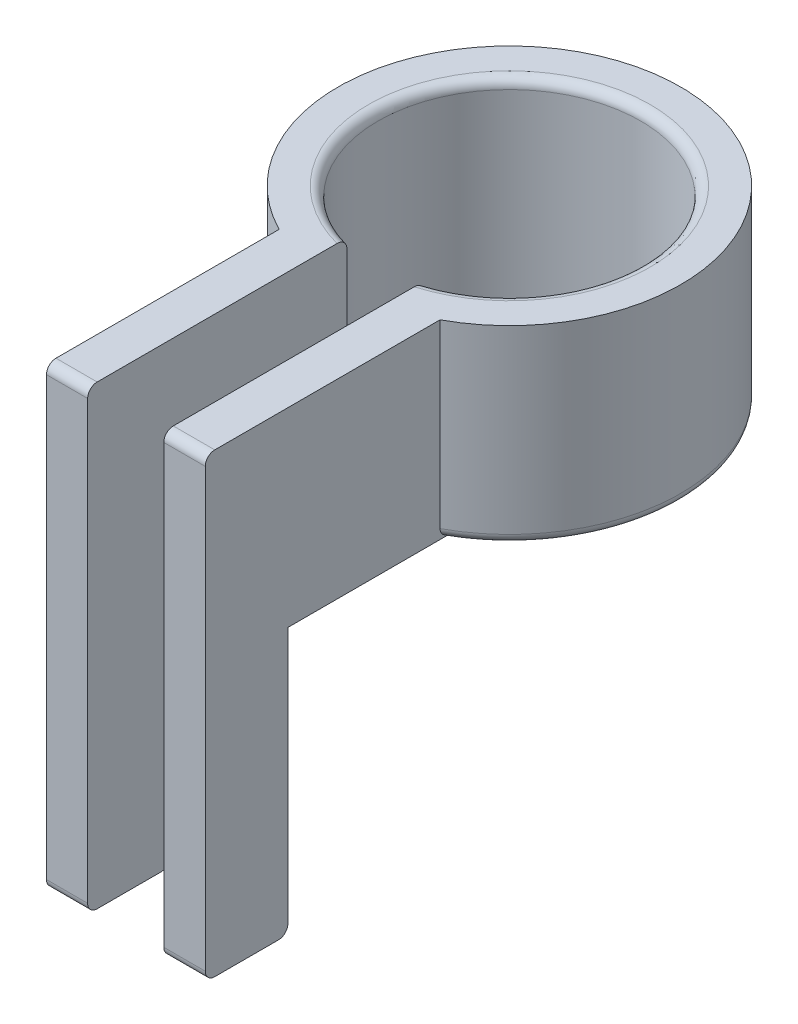
ISO-10303-21;
HEADER;
FILE_DESCRIPTION(('STEP AP214'),'2;1');
FILE_NAME('part.step','',(''),(''),'','','');
FILE_SCHEMA(('AUTOMOTIVE_DESIGN { 1 0 10303 214 1 1 1 1 }'));
ENDSEC;
DATA;
#1=APPLICATION_CONTEXT('core data for automotive mechanical design processes');
#2=APPLICATION_PROTOCOL_DEFINITION('international standard','automotive_design',2000,#1);
#3=PRODUCT_CONTEXT('',#1,'mechanical');
#4=PRODUCT('Part','Part','',(#3));
#5=PRODUCT_RELATED_PRODUCT_CATEGORY('part','',(#4));
#6=PRODUCT_DEFINITION_FORMATION('','',#4);
#7=PRODUCT_DEFINITION_CONTEXT('part definition',#1,'design');
#8=PRODUCT_DEFINITION('design','',#6,#7);
#9=PRODUCT_DEFINITION_SHAPE('','',#8);
#10=(LENGTH_UNIT() NAMED_UNIT(*) SI_UNIT(.MILLI.,.METRE.));
#11=(NAMED_UNIT(*) PLANE_ANGLE_UNIT() SI_UNIT($,.RADIAN.));
#12=(NAMED_UNIT(*) SI_UNIT($,.STERADIAN.) SOLID_ANGLE_UNIT());
#13=UNCERTAINTY_MEASURE_WITH_UNIT(LENGTH_MEASURE(1.E-05),#10,'distance_accuracy_value','');
#14=(GEOMETRIC_REPRESENTATION_CONTEXT(3) GLOBAL_UNCERTAINTY_ASSIGNED_CONTEXT((#13)) GLOBAL_UNIT_ASSIGNED_CONTEXT((#10,
#11,#12)) REPRESENTATION_CONTEXT('',''));
#15=CARTESIAN_POINT('',(0.,0.,0.));
#16=DIRECTION('',(0.,0.,1.));
#17=DIRECTION('',(1.,0.,0.));
#18=AXIS2_PLACEMENT_3D('',#15,#16,#17);
#19=CARTESIAN_POINT('',(2.09705188399781,-4.,12.9634038678451));
#20=DIRECTION('',(1.,0.,0.));
#21=DIRECTION('',(0.,0.,-1.));
#22=AXIS2_PLACEMENT_3D('',#19,#20,#21);
#23=PLANE('',#22);
#24=DIRECTION('',(0.,0.,-1.));
#25=VECTOR('',#24,1.);
#26=CARTESIAN_POINT('',(2.09705188399781,10.,12.9634038678451));
#27=LINE('',#26,#25);
#28=CARTESIAN_POINT('',(2.09705188399781,10.,19.7544731693429));
#29=VERTEX_POINT('',#28);
#30=CARTESIAN_POINT('',(2.09705188399781,10.,7.09664522121694));
#31=VERTEX_POINT('',#30);
#32=EDGE_CURVE('E236',#29,#31,#27,.T.);
#33=ORIENTED_EDGE('',*,*,#32,.T.);
#34=CARTESIAN_POINT('',(2.09705188399781,10.,7.09664522121694));
#35=CARTESIAN_POINT('',(2.09705188399781,10.0000188775019,7.06625435999718));
#36=CARTESIAN_POINT('',(2.09705188399781,9.99745261189992,7.03586584315379));
#37=CARTESIAN_POINT('',(2.09705188399781,9.98729891168458,6.97592711742204));
#38=CARTESIAN_POINT('',(2.09705188399781,9.9797095170185,6.94637724047153));
#39=CARTESIAN_POINT('',(2.09705188399781,9.95965111756215,6.88895219575835));
#40=CARTESIAN_POINT('',(2.09705188399781,9.94717833114842,6.86107834522858));
#41=CARTESIAN_POINT('',(2.09705188399781,9.91765249809959,6.8078823019234));
#42=CARTESIAN_POINT('',(2.09705188399781,9.90060158759663,6.78255892666619));
#43=CARTESIAN_POINT('',(2.09705188399781,9.86268485121475,6.73570644097138));
#44=CARTESIAN_POINT('',(2.09705188399781,9.84189415748589,6.71411662887507));
#45=CARTESIAN_POINT('',(2.09705188399781,9.7968322326706,6.67491908536733));
#46=CARTESIAN_POINT('',(2.09705188399781,9.77256082293616,6.65731155846659));
#47=CARTESIAN_POINT('',(2.09705188399781,9.7223443445838,6.62740549016463));
#48=CARTESIAN_POINT('',(2.09705188399781,9.69651504196629,6.61491231103185));
#49=CARTESIAN_POINT('',(2.09705188399781,9.64307396381817,6.59467453520273));
#50=CARTESIAN_POINT('',(2.09705188399781,9.61546455612112,6.58692376869906));
#51=CARTESIAN_POINT('',(2.09705188399781,9.57299556592643,6.57900624714735));
#52=CARTESIAN_POINT('',(2.09705188399781,9.55845981802753,6.57698436611936));
#53=CARTESIAN_POINT('',(2.09705188399781,9.52928527044598,6.57428791897843));
#54=CARTESIAN_POINT('',(2.09705188399781,9.51464665151205,6.57361139647195));
#55=CARTESIAN_POINT('',(2.09705188399781,9.50000000000002,6.57361189878289));
#56=B_SPLINE_CURVE_WITH_KNOTS('',3,(#34,#35,#36,#37,#38,#39,#40,#41,#42,#43,#44,#45,#46,#47,#48,
#49,#50,#51,#52,#53,#54,#55),.UNSPECIFIED.,.F.,.F.,(4,2,2,2,2,2,2,2,2,2,4),(0.,
0.091062540378094,0.182160634828733,0.273329414217606,0.364455728366105,0.453922459995972,
0.543393785156623,0.629043563638756,0.71458167479767,0.758554227874326,0.802462790045606),.UNSPECIFIED.);
#57=CARTESIAN_POINT('',(2.09705188399781,9.5,6.57361189878299));
#58=VERTEX_POINT('',#57);
#59=EDGE_CURVE('E11',#31,#58,#56,.T.);
#60=ORIENTED_EDGE('',*,*,#59,.T.);
#61=DIRECTION('',(0.,-1.,0.));
#62=VECTOR('',#61,1.);
#63=CARTESIAN_POINT('',(2.09705188399781,10.,6.57361189878299));
#64=LINE('',#63,#62);
#65=CARTESIAN_POINT('',(2.09705188399781,0.,6.57361189878299));
#66=VERTEX_POINT('',#65);
#67=EDGE_CURVE('E248',#58,#66,#64,.T.);
#68=ORIENTED_EDGE('',*,*,#67,.T.);
#69=DIRECTION('',(0.,0.,-1.));
#70=VECTOR('',#69,1.);
#71=CARTESIAN_POINT('',(2.09705188399781,0.,0.));
#72=LINE('',#71,#70);
#73=CARTESIAN_POINT('',(2.09705188399781,0.,15.9099745186424));
#74=VERTEX_POINT('',#73);
#75=EDGE_CURVE('E238',#74,#66,#72,.T.);
#76=ORIENTED_EDGE('',*,*,#75,.F.);
#77=DIRECTION('',(0.,1.,0.));
#78=VECTOR('',#77,1.);
#79=CARTESIAN_POINT('',(2.09705188399781,-4.,15.9099745186424));
#80=LINE('',#79,#78);
#81=CARTESIAN_POINT('',(2.09705188399781,-13.4702890247354,15.9099745186424));
#82=VERTEX_POINT('',#81);
#83=EDGE_CURVE('E203',#82,#74,#80,.T.);
#84=ORIENTED_EDGE('',*,*,#83,.F.);
#85=CARTESIAN_POINT('',(2.09705188399781,-13.4702890247354,16.4099745186424));
#86=DIRECTION('',(1.,0.,0.));
#87=DIRECTION('',(0.,0.,-1.));
#88=AXIS2_PLACEMENT_3D('',#85,#86,#87);
#89=CIRCLE('',#88,0.5);
#90=CARTESIAN_POINT('',(2.09705188399781,-13.9702890247354,16.4099745186424));
#91=VERTEX_POINT('',#90);
#92=EDGE_CURVE('E263',#82,#91,#89,.F.);
#93=ORIENTED_EDGE('',*,*,#92,.T.);
#94=DIRECTION('',(0.,0.,1.));
#95=VECTOR('',#94,1.);
#96=CARTESIAN_POINT('',(2.09705188399781,-13.9702890247354,20.7544731693429));
#97=LINE('',#96,#95);
#98=CARTESIAN_POINT('',(2.09705188399781,-13.9702890247354,19.7544731693429));
#99=VERTEX_POINT('',#98);
#100=EDGE_CURVE('E226',#91,#99,#97,.T.);
#101=ORIENTED_EDGE('',*,*,#100,.T.);
#102=CARTESIAN_POINT('',(2.09705188399781,-13.4702890247354,19.7544731693429));
#103=DIRECTION('',(1.,0.,0.));
#104=DIRECTION('',(0.,0.,-1.));
#105=AXIS2_PLACEMENT_3D('',#102,#103,#104);
#106=CIRCLE('',#105,0.5);
#107=CARTESIAN_POINT('',(2.09705188399781,-13.4702890247354,20.2544731693429));
#108=VERTEX_POINT('',#107);
#109=EDGE_CURVE('E261',#99,#108,#106,.F.);
#110=ORIENTED_EDGE('',*,*,#109,.T.);
#111=DIRECTION('',(0.,-1.,0.));
#112=VECTOR('',#111,1.);
#113=CARTESIAN_POINT('',(2.09705188399781,-4.,20.2544731693429));
#114=LINE('',#113,#112);
#115=CARTESIAN_POINT('',(2.09705188399781,9.5,20.2544731693429));
#116=VERTEX_POINT('',#115);
#117=EDGE_CURVE('E386',#116,#108,#114,.T.);
#118=ORIENTED_EDGE('',*,*,#117,.F.);
#119=CARTESIAN_POINT('',(2.09705188399781,9.5,19.7544731693429));
#120=DIRECTION('',(1.,0.,0.));
#121=DIRECTION('',(0.,0.,-1.));
#122=AXIS2_PLACEMENT_3D('',#119,#120,#121);
#123=CIRCLE('',#122,0.5);
#124=EDGE_CURVE('E259',#116,#29,#123,.F.);
#125=ORIENTED_EDGE('',*,*,#124,.T.);
#126=EDGE_LOOP('',(#33,#60,#68,#76,#84,#93,#101,#110,#118,#125));
#127=FACE_BOUND('',#126,.T.);
#128=ADVANCED_FACE('F35',(#127),#23,.F.);
#129=CARTESIAN_POINT('',(-1.90294811600219,-4.,12.9634038678451));
#130=DIRECTION('',(-1.,0.,0.));
#131=DIRECTION('',(0.,0.,1.));
#132=AXIS2_PLACEMENT_3D('',#129,#130,#131);
#133=PLANE('',#132);
#134=DIRECTION('',(0.,-1.,0.));
#135=VECTOR('',#134,1.);
#136=CARTESIAN_POINT('',(-1.90294811600219,10.,6.63240442583259));
#137=LINE('',#136,#135);
#138=CARTESIAN_POINT('',(-1.90294811600219,0.,6.63240442583259));
#139=VERTEX_POINT('',#138);
#140=CARTESIAN_POINT('',(-1.90294811600219,9.5,6.63240442583259));
#141=VERTEX_POINT('',#140);
#142=EDGE_CURVE('E250',#139,#141,#137,.F.);
#143=ORIENTED_EDGE('',*,*,#142,.T.);
#144=CARTESIAN_POINT('',(-1.90294811600219,9.5,6.63240442583259));
#145=CARTESIAN_POINT('',(-1.90294811600219,9.52735933135736,6.63237578562355));
#146=CARTESIAN_POINT('',(-1.90294811600219,9.55470467174101,6.63473874932025));
#147=CARTESIAN_POINT('',(-1.90294811600219,9.60855728686477,6.64402811425362));
#148=CARTESIAN_POINT('',(-1.90294811600219,9.63506606325586,6.65094578631533));
#149=CARTESIAN_POINT('',(-1.90294811600219,9.68654775867712,6.66912699957518));
#150=CARTESIAN_POINT('',(-1.90294811600219,9.71152056182817,6.68039086820026));
#151=CARTESIAN_POINT('',(-1.90294811600219,9.75926731161516,6.70687987951667));
#152=CARTESIAN_POINT('',(-1.90294811600219,9.78204093102345,6.72210561047205));
#153=CARTESIAN_POINT('',(-1.90294811600219,9.82518842881762,6.75633774751278));
#154=CARTESIAN_POINT('',(-1.90294811600219,9.84551397595586,6.77540500217635));
#155=CARTESIAN_POINT('',(-1.90294811600219,9.88281527166546,6.81657649871765));
#156=CARTESIAN_POINT('',(-1.90294811600219,9.89979015395107,6.83868152348578));
#157=CARTESIAN_POINT('',(-1.90294811600219,9.93055833073667,6.88615778894905));
#158=CARTESIAN_POINT('',(-1.90294811600219,9.9442131837314,6.91161868436731));
#159=CARTESIAN_POINT('',(-1.90294811600219,9.96720221611087,6.96441985737906));
#160=CARTESIAN_POINT('',(-1.90294811600219,9.97653695133058,6.99175989267852));
#161=CARTESIAN_POINT('',(-1.90294811600219,9.98905155348706,7.04114070690321));
#162=CARTESIAN_POINT('',(-1.90294811600219,9.99315348686667,7.06295303154366));
#163=CARTESIAN_POINT('',(-1.90294811600219,9.9986279350332,7.10688774938061));
#164=CARTESIAN_POINT('',(-1.90294811600219,10.0000041054958,7.12900968715703));
#165=CARTESIAN_POINT('',(-1.90294811600219,10.,7.15113896297672));
#166=B_SPLINE_CURVE_WITH_KNOTS('',3,(#144,#145,#146,#147,#148,#149,#150,#151,#152,#153,#154,
#155,#156,#157,#158,#159,#160,#161,#162,#163,#164,#165),.UNSPECIFIED.,.F.,.F.,(4,2,2,2,2,2,2,2,
2,2,4),(0.,0.0819548066880283,0.163753001030306,0.245557358960154,0.32737387027808,
0.410605802400977,0.493859225323879,0.580145723703416,0.666421117201123,0.732841375343013,
0.799172493018446),.UNSPECIFIED.);
#167=CARTESIAN_POINT('',(-1.90294811600219,10.,7.15113896297672));
#168=VERTEX_POINT('',#167);
#169=EDGE_CURVE('E63',#141,#168,#166,.T.);
#170=ORIENTED_EDGE('',*,*,#169,.T.);
#171=DIRECTION('',(0.,0.,1.));
#172=VECTOR('',#171,1.);
#173=CARTESIAN_POINT('',(-1.90294811600219,10.,12.9634038678451));
#174=LINE('',#173,#172);
#175=CARTESIAN_POINT('',(-1.90294811600219,10.,19.7544731693429));
#176=VERTEX_POINT('',#175);
#177=EDGE_CURVE('E198',#168,#176,#174,.T.);
#178=ORIENTED_EDGE('',*,*,#177,.T.);
#179=CARTESIAN_POINT('',(-1.90294811600219,9.5,19.7544731693429));
#180=DIRECTION('',(-1.,0.,0.));
#181=DIRECTION('',(0.,0.,1.));
#182=AXIS2_PLACEMENT_3D('',#179,#180,#181);
#183=CIRCLE('',#182,0.5);
#184=CARTESIAN_POINT('',(-1.90294811600219,9.5,20.2544731693429));
#185=VERTEX_POINT('',#184);
#186=EDGE_CURVE('E280',#176,#185,#183,.F.);
#187=ORIENTED_EDGE('',*,*,#186,.T.);
#188=DIRECTION('',(0.,1.,0.));
#189=VECTOR('',#188,1.);
#190=CARTESIAN_POINT('',(-1.90294811600219,-4.,20.2544731693429));
#191=LINE('',#190,#189);
#192=CARTESIAN_POINT('',(-1.90294811600219,-13.4702890247354,20.2544731693429));
#193=VERTEX_POINT('',#192);
#194=EDGE_CURVE('E208',#193,#185,#191,.T.);
#195=ORIENTED_EDGE('',*,*,#194,.F.);
#196=CARTESIAN_POINT('',(-1.90294811600219,-13.4702890247354,19.7544731693429));
#197=DIRECTION('',(-1.,0.,0.));
#198=DIRECTION('',(0.,0.,1.));
#199=AXIS2_PLACEMENT_3D('',#196,#197,#198);
#200=CIRCLE('',#199,0.5);
#201=CARTESIAN_POINT('',(-1.90294811600219,-13.9702890247354,19.7544731693429));
#202=VERTEX_POINT('',#201);
#203=EDGE_CURVE('E282',#193,#202,#200,.F.);
#204=ORIENTED_EDGE('',*,*,#203,.T.);
#205=DIRECTION('',(0.,0.,-1.));
#206=VECTOR('',#205,1.);
#207=CARTESIAN_POINT('',(-1.90294811600219,-13.9702890247354,20.7544731693429));
#208=LINE('',#207,#206);
#209=CARTESIAN_POINT('',(-1.90294811600219,-13.9702890247354,16.4099745186424));
#210=VERTEX_POINT('',#209);
#211=EDGE_CURVE('E221',#202,#210,#208,.T.);
#212=ORIENTED_EDGE('',*,*,#211,.T.);
#213=CARTESIAN_POINT('',(-1.90294811600219,-13.4702890247354,16.4099745186424));
#214=DIRECTION('',(-1.,0.,0.));
#215=DIRECTION('',(0.,0.,1.));
#216=AXIS2_PLACEMENT_3D('',#213,#214,#215);
#217=CIRCLE('',#216,0.5);
#218=CARTESIAN_POINT('',(-1.90294811600219,-13.4702890247354,15.9099745186424));
#219=VERTEX_POINT('',#218);
#220=EDGE_CURVE('E284',#210,#219,#217,.F.);
#221=ORIENTED_EDGE('',*,*,#220,.T.);
#222=DIRECTION('',(0.,-1.,0.));
#223=VECTOR('',#222,1.);
#224=CARTESIAN_POINT('',(-1.90294811600219,-4.,15.9099745186424));
#225=LINE('',#224,#223);
#226=CARTESIAN_POINT('',(-1.90294811600219,0.,15.9099745186424));
#227=VERTEX_POINT('',#226);
#228=EDGE_CURVE('E214',#227,#219,#225,.T.);
#229=ORIENTED_EDGE('',*,*,#228,.F.);
#230=DIRECTION('',(0.,0.,1.));
#231=VECTOR('',#230,1.);
#232=CARTESIAN_POINT('',(-1.90294811600219,0.,0.));
#233=LINE('',#232,#231);
#234=EDGE_CURVE('E240',#139,#227,#233,.T.);
#235=ORIENTED_EDGE('',*,*,#234,.F.);
#236=EDGE_LOOP('',(#143,#170,#178,#187,#195,#204,#212,#221,#229,#235));
#237=FACE_BOUND('',#236,.T.);
#238=ADVANCED_FACE('F340',(#237),#133,.F.);
#239=CARTESIAN_POINT('',(4.27571816839784,0.,20.7544731693429));
#240=DIRECTION('',(1.,0.,0.));
#241=DIRECTION('',(0.,0.,-1.));
#242=AXIS2_PLACEMENT_3D('',#239,#240,#241);
#243=PLANE('',#242);
#244=DIRECTION('',(0.,0.,-1.));
#245=VECTOR('',#244,1.);
#246=CARTESIAN_POINT('',(4.27571816839784,-13.9702890247354,20.7544731693429));
#247=LINE('',#246,#245);
#248=CARTESIAN_POINT('',(4.27571816839784,-13.9702890247354,19.7544731693429));
#249=VERTEX_POINT('',#248);
#250=CARTESIAN_POINT('',(4.27571816839784,-13.9702890247354,16.4099745186424));
#251=VERTEX_POINT('',#250);
#252=EDGE_CURVE('E224',#249,#251,#247,.T.);
#253=ORIENTED_EDGE('',*,*,#252,.T.);
#254=CARTESIAN_POINT('',(4.27571816839784,-13.4702890247354,16.4099745186424));
#255=DIRECTION('',(1.,0.,0.));
#256=DIRECTION('',(0.,0.,-1.));
#257=AXIS2_PLACEMENT_3D('',#254,#255,#256);
#258=CIRCLE('',#257,0.5);
#259=CARTESIAN_POINT('',(4.27571816839784,-13.4702890247354,15.9099745186424));
#260=VERTEX_POINT('',#259);
#261=EDGE_CURVE('E183',#251,#260,#258,.T.);
#262=ORIENTED_EDGE('',*,*,#261,.T.);
#263=DIRECTION('',(0.,1.,0.));
#264=VECTOR('',#263,1.);
#265=CARTESIAN_POINT('',(4.27571816839784,-18.,15.9099745186424));
#266=LINE('',#265,#264);
#267=CARTESIAN_POINT('',(4.27571816839784,0.,15.9099745186424));
#268=VERTEX_POINT('',#267);
#269=EDGE_CURVE('E176',#260,#268,#266,.T.);
#270=ORIENTED_EDGE('',*,*,#269,.T.);
#271=DIRECTION('',(0.,0.,-1.));
#272=VECTOR('',#271,1.);
#273=CARTESIAN_POINT('',(4.27571816839784,0.,20.7544731693429));
#274=LINE('',#273,#272);
#275=CARTESIAN_POINT('',(4.27571816839784,0.,7.34630751768755));
#276=VERTEX_POINT('',#275);
#277=EDGE_CURVE('E180',#268,#276,#274,.T.);
#278=ORIENTED_EDGE('',*,*,#277,.T.);
#279=CARTESIAN_POINT('',(4.27571816839784,0.,7.34630751768755));
#280=CARTESIAN_POINT('',(4.27571816839784,-2.35764446130284E-05,7.38886967326927));
#281=CARTESIAN_POINT('',(4.27571816839784,0.00406136944300871,7.43152501971392));
#282=CARTESIAN_POINT('',(4.27571816839784,0.0205145574412388,7.51547808303228));
#283=CARTESIAN_POINT('',(4.27571816839784,0.0329354130536198,7.55676541759811));
#284=CARTESIAN_POINT('',(4.27571816839784,0.0636792777047655,7.63001606460742));
#285=CARTESIAN_POINT('',(4.27571816839784,0.0808612233390834,7.66245633374361));
#286=CARTESIAN_POINT('',(4.27571816839784,0.121086003502712,7.72338216355099));
#287=CARTESIAN_POINT('',(4.27571816839784,0.144109781690139,7.75188012587511));
#288=CARTESIAN_POINT('',(4.27571816839784,0.192508418115697,7.80044477241843));
#289=CARTESIAN_POINT('',(4.27571816839784,0.217280285336004,7.82111061945789));
#290=CARTESIAN_POINT('',(4.27571816839784,0.270383913995009,7.85719112874437));
#291=CARTESIAN_POINT('',(4.27571816839784,0.298711426504048,7.8726119784005));
#292=CARTESIAN_POINT('',(4.27571816839784,0.355391681618556,7.89617705713714));
#293=CARTESIAN_POINT('',(4.27571816839784,0.383527049375419,7.90483834368295));
#294=CARTESIAN_POINT('',(4.27571816839784,0.426644121374046,7.91358386898708));
#295=CARTESIAN_POINT('',(4.27571816839784,0.441219852709136,7.91579149701062));
#296=CARTESIAN_POINT('',(4.27571816839784,0.470527168792199,7.91874301369102));
#297=CARTESIAN_POINT('',(4.27571816839784,0.485258839234114,7.91948605050182));
#298=CARTESIAN_POINT('',(4.27571816839784,0.5,7.91948446203619));
#299=B_SPLINE_CURVE_WITH_KNOTS('',3,(#279,#280,#281,#282,#283,#284,#285,#286,#287,#288,#289,
#290,#291,#292,#293,#294,#295,#296,#297,#298),.UNSPECIFIED.,.F.,.F.,(4,2,2,2,2,2,2,2,2,4),(0.,
0.127651011326516,0.256115386932677,0.365627714878256,0.474787300703326,0.570996349010416,
0.667091504726429,0.754811481263913,0.798972236585592,0.843158669432335),.UNSPECIFIED.);
#300=CARTESIAN_POINT('',(4.27571816839784,0.5,7.91948446203619));
#301=VERTEX_POINT('',#300);
#302=EDGE_CURVE('E321',#276,#301,#299,.T.);
#303=ORIENTED_EDGE('',*,*,#302,.T.);
#304=DIRECTION('',(0.,-1.,0.));
#305=VECTOR('',#304,1.);
#306=CARTESIAN_POINT('',(4.27571816839784,10.,7.91948446203619));
#307=LINE('',#306,#305);
#308=CARTESIAN_POINT('',(4.27571816839784,10.,7.91948446203619));
#309=VERTEX_POINT('',#308);
#310=EDGE_CURVE('E252',#309,#301,#307,.T.);
#311=ORIENTED_EDGE('',*,*,#310,.F.);
#312=DIRECTION('',(0.,0.,-1.));
#313=VECTOR('',#312,1.);
#314=CARTESIAN_POINT('',(4.27571816839784,10.,20.7544731693429));
#315=LINE('',#314,#313);
#316=CARTESIAN_POINT('',(4.27571816839784,10.,19.7544731693429));
#317=VERTEX_POINT('',#316);
#318=EDGE_CURVE('E199',#317,#309,#315,.T.);
#319=ORIENTED_EDGE('',*,*,#318,.F.);
#320=CARTESIAN_POINT('',(4.27571816839784,9.5,19.7544731693429));
#321=DIRECTION('',(1.,0.,0.));
#322=DIRECTION('',(0.,0.,-1.));
#323=AXIS2_PLACEMENT_3D('',#320,#321,#322);
#324=CIRCLE('',#323,0.5);
#325=CARTESIAN_POINT('',(4.27571816839784,9.5,20.2544731693429));
#326=VERTEX_POINT('',#325);
#327=EDGE_CURVE('E269',#317,#326,#324,.T.);
#328=ORIENTED_EDGE('',*,*,#327,.T.);
#329=DIRECTION('',(0.,-1.,0.));
#330=VECTOR('',#329,1.);
#331=CARTESIAN_POINT('',(4.27571816839784,0.,20.2544731693429));
#332=LINE('',#331,#330);
#333=CARTESIAN_POINT('',(4.27571816839784,-13.4702890247354,20.2544731693429));
#334=VERTEX_POINT('',#333);
#335=EDGE_CURVE('E378',#326,#334,#332,.T.);
#336=ORIENTED_EDGE('',*,*,#335,.T.);
#337=CARTESIAN_POINT('',(4.27571816839784,-13.4702890247354,19.7544731693429));
#338=DIRECTION('',(1.,0.,0.));
#339=DIRECTION('',(0.,0.,-1.));
#340=AXIS2_PLACEMENT_3D('',#337,#338,#339);
#341=CIRCLE('',#340,0.5);
#342=EDGE_CURVE('E271',#334,#249,#341,.T.);
#343=ORIENTED_EDGE('',*,*,#342,.T.);
#344=EDGE_LOOP('',(#253,#262,#270,#278,#303,#311,#319,#328,#336,#343));
#345=FACE_BOUND('',#344,.T.);
#346=ADVANCED_FACE('F179',(#345),#243,.T.);
#347=CARTESIAN_POINT('',(-4.06706507466038,0.,20.7544731693429));
#348=DIRECTION('',(-1.,0.,0.));
#349=DIRECTION('',(0.,0.,1.));
#350=AXIS2_PLACEMENT_3D('',#347,#348,#349);
#351=PLANE('',#350);
#352=DIRECTION('',(0.,-1.,0.));
#353=VECTOR('',#352,1.);
#354=CARTESIAN_POINT('',(-4.06706507466038,0.,15.9099745186424));
#355=LINE('',#354,#353);
#356=CARTESIAN_POINT('',(-4.06706507466038,0.,15.9099745186424));
#357=VERTEX_POINT('',#356);
#358=CARTESIAN_POINT('',(-4.06706507466038,-13.4702890247354,15.9099745186424));
#359=VERTEX_POINT('',#358);
#360=EDGE_CURVE('E188',#357,#359,#355,.T.);
#361=ORIENTED_EDGE('',*,*,#360,.T.);
#362=CARTESIAN_POINT('',(-4.06706507466038,-13.4702890247354,16.4099745186424));
#363=DIRECTION('',(-1.,0.,0.));
#364=DIRECTION('',(0.,0.,1.));
#365=AXIS2_PLACEMENT_3D('',#362,#363,#364);
#366=CIRCLE('',#365,0.5);
#367=CARTESIAN_POINT('',(-4.06706507466038,-13.9702890247354,16.4099745186424));
#368=VERTEX_POINT('',#367);
#369=EDGE_CURVE('E292',#359,#368,#366,.T.);
#370=ORIENTED_EDGE('',*,*,#369,.T.);
#371=DIRECTION('',(0.,0.,1.));
#372=VECTOR('',#371,1.);
#373=CARTESIAN_POINT('',(-4.06706507466038,-13.9702890247354,20.7544731693429));
#374=LINE('',#373,#372);
#375=CARTESIAN_POINT('',(-4.06706507466038,-13.9702890247354,19.7544731693429));
#376=VERTEX_POINT('',#375);
#377=EDGE_CURVE('E218',#368,#376,#374,.T.);
#378=ORIENTED_EDGE('',*,*,#377,.T.);
#379=CARTESIAN_POINT('',(-4.06706507466038,-13.4702890247354,19.7544731693429));
#380=DIRECTION('',(-1.,0.,0.));
#381=DIRECTION('',(0.,0.,1.));
#382=AXIS2_PLACEMENT_3D('',#379,#380,#381);
#383=CIRCLE('',#382,0.5);
#384=CARTESIAN_POINT('',(-4.06706507466038,-13.4702890247354,20.2544731693429));
#385=VERTEX_POINT('',#384);
#386=EDGE_CURVE('E290',#376,#385,#383,.T.);
#387=ORIENTED_EDGE('',*,*,#386,.T.);
#388=DIRECTION('',(0.,1.,0.));
#389=VECTOR('',#388,1.);
#390=CARTESIAN_POINT('',(-4.06706507466038,0.,20.2544731693429));
#391=LINE('',#390,#389);
#392=CARTESIAN_POINT('',(-4.06706507466038,9.5,20.2544731693429));
#393=VERTEX_POINT('',#392);
#394=EDGE_CURVE('E392',#385,#393,#391,.T.);
#395=ORIENTED_EDGE('',*,*,#394,.T.);
#396=CARTESIAN_POINT('',(-4.06706507466038,9.5,19.7544731693429));
#397=DIRECTION('',(-1.,0.,0.));
#398=DIRECTION('',(0.,0.,1.));
#399=AXIS2_PLACEMENT_3D('',#396,#397,#398);
#400=CIRCLE('',#399,0.5);
#401=CARTESIAN_POINT('',(-4.06706507466038,10.,19.7544731693429));
#402=VERTEX_POINT('',#401);
#403=EDGE_CURVE('E288',#393,#402,#400,.T.);
#404=ORIENTED_EDGE('',*,*,#403,.T.);
#405=DIRECTION('',(0.,0.,1.));
#406=VECTOR('',#405,1.);
#407=CARTESIAN_POINT('',(-4.06706507466038,10.,20.7544731693429));
#408=LINE('',#407,#406);
#409=CARTESIAN_POINT('',(-4.06706507466038,10.,8.02863510682094));
#410=VERTEX_POINT('',#409);
#411=EDGE_CURVE('E229',#410,#402,#408,.T.);
#412=ORIENTED_EDGE('',*,*,#411,.F.);
#413=DIRECTION('',(0.,-1.,0.));
#414=VECTOR('',#413,1.);
#415=CARTESIAN_POINT('',(-4.06706507466038,10.,8.02863510682094));
#416=LINE('',#415,#414);
#417=CARTESIAN_POINT('',(-4.06706507466038,0.5,8.02863510682094));
#418=VERTEX_POINT('',#417);
#419=EDGE_CURVE('E255',#418,#410,#416,.F.);
#420=ORIENTED_EDGE('',*,*,#419,.F.);
#421=CARTESIAN_POINT('',(-4.06706507466038,0.5,8.02863510682094));
#422=CARTESIAN_POINT('',(-4.06706507466038,0.474078923075776,8.02867012571728));
#423=CARTESIAN_POINT('',(-4.06706507466038,0.448181500841247,8.02637803952666));
#424=CARTESIAN_POINT('',(-4.06706507466038,0.397246753554557,8.01741854540544));
#425=CARTESIAN_POINT('',(-4.06706507466038,0.372206681333889,8.0107668300624));
#426=CARTESIAN_POINT('',(-4.06706507466038,0.323616501055747,7.99336804851931));
#427=CARTESIAN_POINT('',(-4.06706507466038,0.300065605387725,7.98262316863815));
#428=CARTESIAN_POINT('',(-4.06706507466038,0.254993799738618,7.9574834025458));
#429=CARTESIAN_POINT('',(-4.06706507466038,0.233474166521266,7.94308624135607));
#430=CARTESIAN_POINT('',(-4.06706507466038,0.192076074713352,7.91050363010137));
#431=CARTESIAN_POINT('',(-4.06706507466038,0.172301285297797,7.89218690381308));
#432=CARTESIAN_POINT('',(-4.06706507466038,0.135763855214647,7.85277390013181));
#433=CARTESIAN_POINT('',(-4.06706507466038,0.119001780248579,7.8316771020072));
#434=CARTESIAN_POINT('',(-4.06706507466038,0.0871411599132048,7.78502721845555));
#435=CARTESIAN_POINT('',(-4.06706507466038,0.0723871947021427,7.75923906779614));
#436=CARTESIAN_POINT('',(-4.06706507466038,0.046911373477451,7.70572564196134));
#437=CARTESIAN_POINT('',(-4.06706507466038,0.0361937104033409,7.6779983876779));
#438=CARTESIAN_POINT('',(-4.06706507466038,0.0183295420077129,7.61956953021481));
#439=CARTESIAN_POINT('',(-4.06706507466038,0.0114402511571292,7.58878962275175));
#440=CARTESIAN_POINT('',(-4.06706507466038,0.00227725225318713,7.52661386760995));
#441=CARTESIAN_POINT('',(-4.06706507466038,-6.14373227597225E-06,7.49521945330379));
#442=CARTESIAN_POINT('',(-4.06706507466038,0.,7.46384496613359));
#443=B_SPLINE_CURVE_WITH_KNOTS('',3,(#421,#422,#423,#424,#425,#426,#427,#428,#429,#430,#431,
#432,#433,#434,#435,#436,#437,#438,#439,#440,#441,#442),.UNSPECIFIED.,.F.,.F.,(4,2,2,2,2,2,2,2,
2,2,4),(0.,0.0776251249431041,0.154972359726291,0.23227833813118,0.309632588594535,
0.390163051954465,0.470708620868398,0.559477877237752,0.648339095039285,0.742611618204952,
0.836685643098647),.UNSPECIFIED.);
#444=CARTESIAN_POINT('',(-4.06706507466038,0.,7.46384496613359));
#445=VERTEX_POINT('',#444);
#446=EDGE_CURVE('E313',#418,#445,#443,.T.);
#447=ORIENTED_EDGE('',*,*,#446,.T.);
#448=DIRECTION('',(0.,0.,1.));
#449=VECTOR('',#448,1.);
#450=CARTESIAN_POINT('',(-4.06706507466038,0.,20.7544731693429));
#451=LINE('',#450,#449);
#452=EDGE_CURVE('E230',#445,#357,#451,.T.);
#453=ORIENTED_EDGE('',*,*,#452,.T.);
#454=EDGE_LOOP('',(#361,#370,#378,#387,#395,#404,#412,#420,#447,#453));
#455=FACE_BOUND('',#454,.T.);
#456=ADVANCED_FACE('F331',(#455),#351,.T.);
#457=CARTESIAN_POINT('',(0.,-13.9702890247354,0.));
#458=DIRECTION('',(0.,1.,0.));
#459=DIRECTION('',(0.,0.,1.));
#460=AXIS2_PLACEMENT_3D('',#457,#458,#459);
#461=PLANE('',#460);
#462=ORIENTED_EDGE('',*,*,#100,.F.);
#463=DIRECTION('',(-1.,0.,0.));
#464=VECTOR('',#463,1.);
#465=CARTESIAN_POINT('',(4.27571816839784,-13.9702890247354,16.4099745186424));
#466=LINE('',#465,#464);
#467=EDGE_CURVE('E267',#91,#251,#466,.F.);
#468=ORIENTED_EDGE('',*,*,#467,.T.);
#469=ORIENTED_EDGE('',*,*,#252,.F.);
#470=DIRECTION('',(1.,0.,0.));
#471=VECTOR('',#470,1.);
#472=CARTESIAN_POINT('',(2.09705188399781,-13.9702890247354,19.7544731693429));
#473=LINE('',#472,#471);
#474=EDGE_CURVE('E265',#249,#99,#473,.F.);
#475=ORIENTED_EDGE('',*,*,#474,.T.);
#476=EDGE_LOOP('',(#462,#468,#469,#475));
#477=FACE_BOUND('',#476,.T.);
#478=ADVANCED_FACE('F335',(#477),#461,.F.);
#479=CARTESIAN_POINT('',(0.,-13.9702890247354,0.));
#480=DIRECTION('',(0.,-1.,0.));
#481=DIRECTION('',(0.,0.,-1.));
#482=AXIS2_PLACEMENT_3D('',#479,#480,#481);
#483=PLANE('',#482);
#484=ORIENTED_EDGE('',*,*,#377,.F.);
#485=DIRECTION('',(1.,0.,0.));
#486=VECTOR('',#485,1.);
#487=CARTESIAN_POINT('',(0.,-13.9702890247354,16.4099745186424));
#488=LINE('',#487,#486);
#489=EDGE_CURVE('E277',#368,#210,#488,.T.);
#490=ORIENTED_EDGE('',*,*,#489,.T.);
#491=ORIENTED_EDGE('',*,*,#211,.F.);
#492=DIRECTION('',(-1.,0.,0.));
#493=VECTOR('',#492,1.);
#494=CARTESIAN_POINT('',(0.,-13.9702890247354,19.7544731693429));
#495=LINE('',#494,#493);
#496=EDGE_CURVE('E274',#202,#376,#495,.T.);
#497=ORIENTED_EDGE('',*,*,#496,.T.);
#498=EDGE_LOOP('',(#484,#490,#491,#497));
#499=FACE_BOUND('',#498,.T.);
#500=ADVANCED_FACE('F468',(#499),#483,.T.);
#501=CARTESIAN_POINT('',(0.,10.,0.));
#502=DIRECTION('',(0.,1.,0.));
#503=DIRECTION('',(0.,0.,1.));
#504=AXIS2_PLACEMENT_3D('',#501,#502,#503);
#505=PLANE('',#504);
#506=ORIENTED_EDGE('',*,*,#177,.F.);
#507=CARTESIAN_POINT('',(0.,10.,0.));
#508=DIRECTION('',(0.,1.,0.));
#509=DIRECTION('',(0.,0.,1.));
#510=AXIS2_PLACEMENT_3D('',#507,#508,#509);
#511=CIRCLE('',#510,7.4);
#512=EDGE_CURVE('E49',#168,#31,#511,.F.);
#513=ORIENTED_EDGE('',*,*,#512,.T.);
#514=ORIENTED_EDGE('',*,*,#32,.F.);
#515=DIRECTION('',(1.,0.,0.));
#516=VECTOR('',#515,1.);
#517=CARTESIAN_POINT('',(0.,10.,19.7544731693429));
#518=LINE('',#517,#516);
#519=EDGE_CURVE('E306',#29,#317,#518,.T.);
#520=ORIENTED_EDGE('',*,*,#519,.T.);
#521=ORIENTED_EDGE('',*,*,#318,.T.);
#522=CARTESIAN_POINT('',(0.,10.,0.));
#523=DIRECTION('',(0.,1.,0.));
#524=DIRECTION('',(0.,0.,1.));
#525=AXIS2_PLACEMENT_3D('',#522,#523,#524);
#526=CIRCLE('',#525,9.);
#527=EDGE_CURVE('E245',#309,#410,#526,.T.);
#528=ORIENTED_EDGE('',*,*,#527,.T.);
#529=ORIENTED_EDGE('',*,*,#411,.T.);
#530=DIRECTION('',(1.,0.,0.));
#531=VECTOR('',#530,1.);
#532=CARTESIAN_POINT('',(0.,10.,19.7544731693429));
#533=LINE('',#532,#531);
#534=EDGE_CURVE('E303',#402,#176,#533,.T.);
#535=ORIENTED_EDGE('',*,*,#534,.T.);
#536=EDGE_LOOP('',(#506,#513,#514,#520,#521,#528,#529,#535));
#537=FACE_BOUND('',#536,.T.);
#538=ADVANCED_FACE('F374',(#537),#505,.T.);
#539=CARTESIAN_POINT('',(0.,0.,0.));
#540=DIRECTION('',(0.,1.,0.));
#541=DIRECTION('',(0.,0.,1.));
#542=AXIS2_PLACEMENT_3D('',#539,#540,#541);
#543=PLANE('',#542);
#544=ORIENTED_EDGE('',*,*,#452,.F.);
#545=CARTESIAN_POINT('',(0.,0.,0.));
#546=DIRECTION('',(0.,1.,0.));
#547=DIRECTION('',(0.,0.,1.));
#548=AXIS2_PLACEMENT_3D('',#545,#546,#547);
#549=CIRCLE('',#548,8.5);
#550=EDGE_CURVE('E196',#445,#276,#549,.F.);
#551=ORIENTED_EDGE('',*,*,#550,.T.);
#552=ORIENTED_EDGE('',*,*,#277,.F.);
#553=DIRECTION('',(-1.,0.,0.));
#554=VECTOR('',#553,1.);
#555=CARTESIAN_POINT('',(4.27571816839784,0.,15.9099745186424));
#556=LINE('',#555,#554);
#557=EDGE_CURVE('E189',#268,#74,#556,.T.);
#558=ORIENTED_EDGE('',*,*,#557,.T.);
#559=ORIENTED_EDGE('',*,*,#75,.T.);
#560=CARTESIAN_POINT('',(0.,0.,0.));
#561=DIRECTION('',(0.,1.,0.));
#562=DIRECTION('',(0.,0.,1.));
#563=AXIS2_PLACEMENT_3D('',#560,#561,#562);
#564=CIRCLE('',#563,6.9);
#565=EDGE_CURVE('E242',#66,#139,#564,.T.);
#566=ORIENTED_EDGE('',*,*,#565,.T.);
#567=ORIENTED_EDGE('',*,*,#234,.T.);
#568=EDGE_CURVE('E205',#227,#357,#556,.T.);
#569=ORIENTED_EDGE('',*,*,#568,.T.);
#570=EDGE_LOOP('',(#544,#551,#552,#558,#559,#566,#567,#569));
#571=FACE_BOUND('',#570,.T.);
#572=ADVANCED_FACE('F193',(#571),#543,.F.);
#573=CARTESIAN_POINT('',(0.,10.,0.));
#574=DIRECTION('',(0.,-1.,0.));
#575=DIRECTION('',(0.,0.,-1.));
#576=AXIS2_PLACEMENT_3D('',#573,#574,#575);
#577=CYLINDRICAL_SURFACE('',#576,9.);
#578=ORIENTED_EDGE('',*,*,#310,.T.);
#579=CARTESIAN_POINT('',(0.,0.5,0.));
#580=DIRECTION('',(0.,1.,0.));
#581=DIRECTION('',(0.,0.,1.));
#582=AXIS2_PLACEMENT_3D('',#579,#580,#581);
#583=CIRCLE('',#582,9.);
#584=EDGE_CURVE('E309',#301,#418,#583,.T.);
#585=ORIENTED_EDGE('',*,*,#584,.T.);
#586=ORIENTED_EDGE('',*,*,#419,.T.);
#587=ORIENTED_EDGE('',*,*,#527,.F.);
#588=EDGE_LOOP('',(#578,#585,#586,#587));
#589=FACE_BOUND('',#588,.T.);
#590=ADVANCED_FACE('F367',(#589),#577,.T.);
#591=CARTESIAN_POINT('',(0.,10.,0.));
#592=DIRECTION('',(0.,-1.,0.));
#593=DIRECTION('',(0.,0.,-1.));
#594=AXIS2_PLACEMENT_3D('',#591,#592,#593);
#595=CYLINDRICAL_SURFACE('',#594,6.9);
#596=ORIENTED_EDGE('',*,*,#67,.F.);
#597=CARTESIAN_POINT('',(0.,9.5,0.));
#598=DIRECTION('',(0.,1.,0.));
#599=DIRECTION('',(0.,0.,1.));
#600=AXIS2_PLACEMENT_3D('',#597,#598,#599);
#601=CIRCLE('',#600,6.9);
#602=EDGE_CURVE('E355',#58,#141,#601,.T.);
#603=ORIENTED_EDGE('',*,*,#602,.T.);
#604=ORIENTED_EDGE('',*,*,#142,.F.);
#605=ORIENTED_EDGE('',*,*,#565,.F.);
#606=EDGE_LOOP('',(#596,#603,#604,#605));
#607=FACE_BOUND('',#606,.T.);
#608=ADVANCED_FACE('F348',(#607),#595,.F.);
#609=CARTESIAN_POINT('',(4.27571816839784,-18.,15.9099745186424));
#610=DIRECTION('',(0.,0.,-1.));
#611=DIRECTION('',(-1.,0.,0.));
#612=AXIS2_PLACEMENT_3D('',#609,#610,#611);
#613=PLANE('',#612);
#614=ORIENTED_EDGE('',*,*,#228,.T.);
#615=DIRECTION('',(1.,0.,0.));
#616=VECTOR('',#615,1.);
#617=CARTESIAN_POINT('',(4.27571816839784,-13.4702890247354,15.9099745186424));
#618=LINE('',#617,#616);
#619=EDGE_CURVE('E286',#219,#359,#618,.F.);
#620=ORIENTED_EDGE('',*,*,#619,.T.);
#621=ORIENTED_EDGE('',*,*,#360,.F.);
#622=ORIENTED_EDGE('',*,*,#568,.F.);
#623=EDGE_LOOP('',(#614,#620,#621,#622));
#624=FACE_BOUND('',#623,.T.);
#625=ADVANCED_FACE('F456',(#624),#613,.T.);
#626=ORIENTED_EDGE('',*,*,#269,.F.);
#627=DIRECTION('',(-1.,0.,0.));
#628=VECTOR('',#627,1.);
#629=CARTESIAN_POINT('',(2.09705188399781,-13.4702890247354,15.9099745186424));
#630=LINE('',#629,#628);
#631=EDGE_CURVE('E257',#260,#82,#630,.T.);
#632=ORIENTED_EDGE('',*,*,#631,.T.);
#633=ORIENTED_EDGE('',*,*,#83,.T.);
#634=ORIENTED_EDGE('',*,*,#557,.F.);
#635=EDGE_LOOP('',(#626,#632,#633,#634));
#636=FACE_BOUND('',#635,.T.);
#637=ADVANCED_FACE('F201',(#636),#613,.T.);
#638=CARTESIAN_POINT('',(-4.06706507466038,10.,20.2544731693429));
#639=DIRECTION('',(0.,0.,1.));
#640=DIRECTION('',(1.,0.,0.));
#641=AXIS2_PLACEMENT_3D('',#638,#639,#640);
#642=PLANE('',#641);
#643=ORIENTED_EDGE('',*,*,#117,.T.);
#644=DIRECTION('',(1.,0.,0.));
#645=VECTOR('',#644,1.);
#646=CARTESIAN_POINT('',(4.27571816839784,-13.4702890247354,20.2544731693429));
#647=LINE('',#646,#645);
#648=EDGE_CURVE('E300',#108,#334,#647,.T.);
#649=ORIENTED_EDGE('',*,*,#648,.T.);
#650=ORIENTED_EDGE('',*,*,#335,.F.);
#651=DIRECTION('',(1.,0.,0.));
#652=VECTOR('',#651,1.);
#653=CARTESIAN_POINT('',(-4.06706507466038,9.5,20.2544731693429));
#654=LINE('',#653,#652);
#655=EDGE_CURVE('E298',#326,#116,#654,.F.);
#656=ORIENTED_EDGE('',*,*,#655,.T.);
#657=EDGE_LOOP('',(#643,#649,#650,#656));
#658=FACE_BOUND('',#657,.T.);
#659=ADVANCED_FACE('F383',(#658),#642,.T.);
#660=ORIENTED_EDGE('',*,*,#394,.F.);
#661=DIRECTION('',(-1.,0.,0.));
#662=VECTOR('',#661,1.);
#663=CARTESIAN_POINT('',(-4.06706507466038,-13.4702890247354,20.2544731693429));
#664=LINE('',#663,#662);
#665=EDGE_CURVE('E296',#385,#193,#664,.F.);
#666=ORIENTED_EDGE('',*,*,#665,.T.);
#667=ORIENTED_EDGE('',*,*,#194,.T.);
#668=DIRECTION('',(1.,0.,0.));
#669=VECTOR('',#668,1.);
#670=CARTESIAN_POINT('',(-4.06706507466038,9.5,20.2544731693429));
#671=LINE('',#670,#669);
#672=EDGE_CURVE('E294',#185,#393,#671,.F.);
#673=ORIENTED_EDGE('',*,*,#672,.T.);
#674=EDGE_LOOP('',(#660,#666,#667,#673));
#675=FACE_BOUND('',#674,.T.);
#676=ADVANCED_FACE('F399',(#675),#642,.T.);
#677=CARTESIAN_POINT('',(4.27571816839784,-13.4702890247354,16.4099745186424));
#678=DIRECTION('',(1.,0.,0.));
#679=DIRECTION('',(0.,0.,-1.));
#680=AXIS2_PLACEMENT_3D('',#677,#678,#679);
#681=CYLINDRICAL_SURFACE('',#680,0.5);
#682=ORIENTED_EDGE('',*,*,#261,.F.);
#683=ORIENTED_EDGE('',*,*,#467,.F.);
#684=ORIENTED_EDGE('',*,*,#92,.F.);
#685=ORIENTED_EDGE('',*,*,#631,.F.);
#686=EDGE_LOOP('',(#682,#683,#684,#685));
#687=FACE_BOUND('',#686,.T.);
#688=ADVANCED_FACE('F414',(#687),#681,.T.);
#689=CARTESIAN_POINT('',(0.,-13.4702890247354,16.4099745186424));
#690=DIRECTION('',(1.,0.,0.));
#691=DIRECTION('',(0.,0.,-1.));
#692=AXIS2_PLACEMENT_3D('',#689,#690,#691);
#693=CYLINDRICAL_SURFACE('',#692,0.5);
#694=ORIENTED_EDGE('',*,*,#369,.F.);
#695=ORIENTED_EDGE('',*,*,#619,.F.);
#696=ORIENTED_EDGE('',*,*,#220,.F.);
#697=ORIENTED_EDGE('',*,*,#489,.F.);
#698=EDGE_LOOP('',(#694,#695,#696,#697));
#699=FACE_BOUND('',#698,.T.);
#700=ADVANCED_FACE('F416',(#699),#693,.T.);
#701=CARTESIAN_POINT('',(0.,-13.4702890247354,19.7544731693429));
#702=DIRECTION('',(-1.,0.,0.));
#703=DIRECTION('',(0.,0.,1.));
#704=AXIS2_PLACEMENT_3D('',#701,#702,#703);
#705=CYLINDRICAL_SURFACE('',#704,0.5);
#706=ORIENTED_EDGE('',*,*,#203,.F.);
#707=ORIENTED_EDGE('',*,*,#665,.F.);
#708=ORIENTED_EDGE('',*,*,#386,.F.);
#709=ORIENTED_EDGE('',*,*,#496,.F.);
#710=EDGE_LOOP('',(#706,#707,#708,#709));
#711=FACE_BOUND('',#710,.T.);
#712=ADVANCED_FACE('F422',(#711),#705,.T.);
#713=CARTESIAN_POINT('',(-4.06706507466038,-13.4702890247354,19.7544731693429));
#714=DIRECTION('',(-1.,0.,0.));
#715=DIRECTION('',(0.,0.,1.));
#716=AXIS2_PLACEMENT_3D('',#713,#714,#715);
#717=CYLINDRICAL_SURFACE('',#716,0.5);
#718=ORIENTED_EDGE('',*,*,#109,.F.);
#719=ORIENTED_EDGE('',*,*,#474,.F.);
#720=ORIENTED_EDGE('',*,*,#342,.F.);
#721=ORIENTED_EDGE('',*,*,#648,.F.);
#722=EDGE_LOOP('',(#718,#719,#720,#721));
#723=FACE_BOUND('',#722,.T.);
#724=ADVANCED_FACE('F431',(#723),#717,.T.);
#725=CARTESIAN_POINT('',(0.,9.5,19.7544731693429));
#726=DIRECTION('',(1.,0.,0.));
#727=DIRECTION('',(0.,0.,-1.));
#728=AXIS2_PLACEMENT_3D('',#725,#726,#727);
#729=CYLINDRICAL_SURFACE('',#728,0.5);
#730=ORIENTED_EDGE('',*,*,#124,.F.);
#731=ORIENTED_EDGE('',*,*,#655,.F.);
#732=ORIENTED_EDGE('',*,*,#327,.F.);
#733=ORIENTED_EDGE('',*,*,#519,.F.);
#734=EDGE_LOOP('',(#730,#731,#732,#733));
#735=FACE_BOUND('',#734,.T.);
#736=ADVANCED_FACE('F389',(#735),#729,.T.);
#737=CARTESIAN_POINT('',(0.,9.5,19.7544731693429));
#738=DIRECTION('',(1.,0.,0.));
#739=DIRECTION('',(0.,0.,-1.));
#740=AXIS2_PLACEMENT_3D('',#737,#738,#739);
#741=CYLINDRICAL_SURFACE('',#740,0.5);
#742=ORIENTED_EDGE('',*,*,#403,.F.);
#743=ORIENTED_EDGE('',*,*,#672,.F.);
#744=ORIENTED_EDGE('',*,*,#186,.F.);
#745=ORIENTED_EDGE('',*,*,#534,.F.);
#746=EDGE_LOOP('',(#742,#743,#744,#745));
#747=FACE_BOUND('',#746,.T.);
#748=ADVANCED_FACE('F404',(#747),#741,.T.);
#749=CARTESIAN_POINT('',(0.,0.5,0.));
#750=DIRECTION('',(0.,1.,0.));
#751=DIRECTION('',(0.,0.,1.));
#752=AXIS2_PLACEMENT_3D('',#749,#750,#751);
#753=TOROIDAL_SURFACE('',#752,8.5,0.5);
#754=ORIENTED_EDGE('',*,*,#302,.F.);
#755=ORIENTED_EDGE('',*,*,#550,.F.);
#756=ORIENTED_EDGE('',*,*,#446,.F.);
#757=ORIENTED_EDGE('',*,*,#584,.F.);
#758=EDGE_LOOP('',(#754,#755,#756,#757));
#759=FACE_BOUND('',#758,.T.);
#760=ADVANCED_FACE('F328',(#759),#753,.T.);
#761=CARTESIAN_POINT('',(0.,9.5,0.));
#762=DIRECTION('',(0.,1.,0.));
#763=DIRECTION('',(0.,0.,1.));
#764=AXIS2_PLACEMENT_3D('',#761,#762,#763);
#765=TOROIDAL_SURFACE('',#764,7.4,0.5);
#766=ORIENTED_EDGE('',*,*,#59,.F.);
#767=ORIENTED_EDGE('',*,*,#512,.F.);
#768=ORIENTED_EDGE('',*,*,#169,.F.);
#769=ORIENTED_EDGE('',*,*,#602,.F.);
#770=EDGE_LOOP('',(#766,#767,#768,#769));
#771=FACE_BOUND('',#770,.T.);
#772=ADVANCED_FACE('F37',(#771),#765,.T.);
#773=CLOSED_SHELL('',(#128,#238,#346,#456,#478,#500,#538,#572,#590,#608,#625,#637,#659,#676,
#688,#700,#712,#724,#736,#748,#760,#772));
#774=MANIFOLD_SOLID_BREP('B2',#773);
#775=ADVANCED_BREP_SHAPE_REPRESENTATION('',(#18,#774),#14);
#776=SHAPE_DEFINITION_REPRESENTATION(#9,#775);
ENDSEC;
END-ISO-10303-21;
